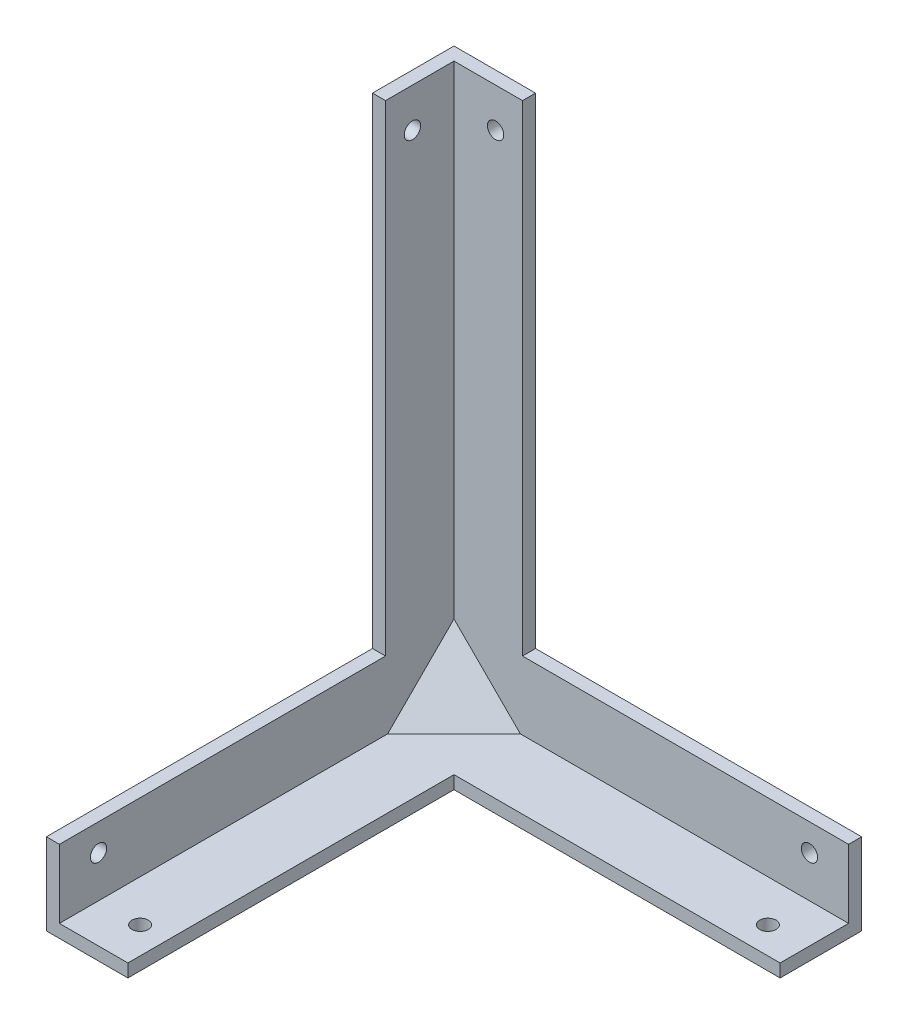
ISO-10303-21;
HEADER;
FILE_DESCRIPTION(('STEP AP214'),'2;1');
FILE_NAME('part.step','',(''),(''),'','','');
FILE_SCHEMA(('AUTOMOTIVE_DESIGN { 1 0 10303 214 1 1 1 1 }'));
ENDSEC;
DATA;
#1=APPLICATION_CONTEXT('core data for automotive mechanical design processes');
#2=APPLICATION_PROTOCOL_DEFINITION('international standard','automotive_design',2000,#1);
#3=PRODUCT_CONTEXT('',#1,'mechanical');
#4=PRODUCT('Part','Part','',(#3));
#5=PRODUCT_RELATED_PRODUCT_CATEGORY('part','',(#4));
#6=PRODUCT_DEFINITION_FORMATION('','',#4);
#7=PRODUCT_DEFINITION_CONTEXT('part definition',#1,'design');
#8=PRODUCT_DEFINITION('design','',#6,#7);
#9=PRODUCT_DEFINITION_SHAPE('','',#8);
#10=(LENGTH_UNIT() NAMED_UNIT(*) SI_UNIT(.MILLI.,.METRE.));
#11=(NAMED_UNIT(*) PLANE_ANGLE_UNIT() SI_UNIT($,.RADIAN.));
#12=(NAMED_UNIT(*) SI_UNIT($,.STERADIAN.) SOLID_ANGLE_UNIT());
#13=UNCERTAINTY_MEASURE_WITH_UNIT(LENGTH_MEASURE(1.E-05),#10,'distance_accuracy_value','');
#14=(GEOMETRIC_REPRESENTATION_CONTEXT(3) GLOBAL_UNCERTAINTY_ASSIGNED_CONTEXT((#13)) GLOBAL_UNIT_ASSIGNED_CONTEXT((#10,
#11,#12)) REPRESENTATION_CONTEXT('',''));
#15=CARTESIAN_POINT('',(0.,0.,0.));
#16=DIRECTION('',(0.,0.,1.));
#17=DIRECTION('',(1.,0.,0.));
#18=AXIS2_PLACEMENT_3D('',#15,#16,#17);
#19=CARTESIAN_POINT('',(4.,25.,125.));
#20=DIRECTION('',(0.,-1.,0.));
#21=DIRECTION('',(0.,0.,-1.));
#22=AXIS2_PLACEMENT_3D('',#19,#20,#21);
#23=PLANE('',#22);
#24=DIRECTION('',(0.,0.,-1.));
#25=VECTOR('',#24,1.);
#26=CARTESIAN_POINT('',(4.,25.,125.));
#27=LINE('',#26,#25);
#28=CARTESIAN_POINT('',(4.,25.,125.));
#29=VERTEX_POINT('',#28);
#30=CARTESIAN_POINT('',(4.,25.,25.));
#31=VERTEX_POINT('',#30);
#32=EDGE_CURVE('E270',#29,#31,#27,.T.);
#33=ORIENTED_EDGE('',*,*,#32,.T.);
#34=DIRECTION('',(-1.,0.,0.));
#35=VECTOR('',#34,1.);
#36=CARTESIAN_POINT('',(4.,25.,25.));
#37=LINE('',#36,#35);
#38=CARTESIAN_POINT('',(0.,25.,25.));
#39=VERTEX_POINT('',#38);
#40=EDGE_CURVE('E221',#31,#39,#37,.T.);
#41=ORIENTED_EDGE('',*,*,#40,.T.);
#42=DIRECTION('',(0.,0.,-1.));
#43=VECTOR('',#42,1.);
#44=CARTESIAN_POINT('',(0.,25.,125.));
#45=LINE('',#44,#43);
#46=CARTESIAN_POINT('',(0.,25.,125.));
#47=VERTEX_POINT('',#46);
#48=EDGE_CURVE('E47',#47,#39,#45,.T.);
#49=ORIENTED_EDGE('',*,*,#48,.F.);
#50=DIRECTION('',(-1.,0.,0.));
#51=VECTOR('',#50,1.);
#52=CARTESIAN_POINT('',(4.,25.,125.));
#53=LINE('',#52,#51);
#54=EDGE_CURVE('E256',#29,#47,#53,.T.);
#55=ORIENTED_EDGE('',*,*,#54,.F.);
#56=EDGE_LOOP('',(#33,#41,#49,#55));
#57=FACE_BOUND('',#56,.T.);
#58=ADVANCED_FACE('F39',(#57),#23,.F.);
#59=DIRECTION('',(-1.,0.,0.));
#60=VECTOR('',#59,1.);
#61=CARTESIAN_POINT('',(4.,25.,0.));
#62=LINE('',#61,#60);
#63=CARTESIAN_POINT('',(125.,25.,0.));
#64=VERTEX_POINT('',#63);
#65=CARTESIAN_POINT('',(25.,25.,0.));
#66=VERTEX_POINT('',#65);
#67=EDGE_CURVE('E255',#64,#66,#62,.T.);
#68=ORIENTED_EDGE('',*,*,#67,.T.);
#69=DIRECTION('',(0.,0.,1.));
#70=VECTOR('',#69,1.);
#71=CARTESIAN_POINT('',(25.,25.,125.));
#72=LINE('',#71,#70);
#73=CARTESIAN_POINT('',(25.,25.,4.));
#74=VERTEX_POINT('',#73);
#75=EDGE_CURVE('E212',#66,#74,#72,.T.);
#76=ORIENTED_EDGE('',*,*,#75,.T.);
#77=DIRECTION('',(-1.,0.,0.));
#78=VECTOR('',#77,1.);
#79=CARTESIAN_POINT('',(125.,25.,4.));
#80=LINE('',#79,#78);
#81=CARTESIAN_POINT('',(125.,25.,4.));
#82=VERTEX_POINT('',#81);
#83=EDGE_CURVE('E243',#82,#74,#80,.T.);
#84=ORIENTED_EDGE('',*,*,#83,.F.);
#85=DIRECTION('',(0.,0.,-1.));
#86=VECTOR('',#85,1.);
#87=CARTESIAN_POINT('',(125.,25.,0.));
#88=LINE('',#87,#86);
#89=EDGE_CURVE('E236',#82,#64,#88,.T.);
#90=ORIENTED_EDGE('',*,*,#89,.T.);
#91=EDGE_LOOP('',(#68,#76,#84,#90));
#92=FACE_BOUND('',#91,.T.);
#93=ADVANCED_FACE('F41',(#92),#23,.F.);
#94=CARTESIAN_POINT('',(0.,25.,125.));
#95=DIRECTION('',(1.,0.,0.));
#96=DIRECTION('',(0.,1.,0.));
#97=AXIS2_PLACEMENT_3D('',#94,#95,#96);
#98=PLANE('',#97);
#99=CARTESIAN_POINT('',(0.,16.75,113.));
#100=DIRECTION('',(1.,0.,0.));
#101=DIRECTION('',(0.,0.,-1.));
#102=AXIS2_PLACEMENT_3D('',#99,#100,#101);
#103=CIRCLE('',#102,2.5);
#104=CARTESIAN_POINT('',(0.,16.75,110.5));
#105=VERTEX_POINT('',#104);
#106=EDGE_CURVE('E172',#105,#105,#103,.T.);
#107=ORIENTED_EDGE('',*,*,#106,.T.);
#108=EDGE_LOOP('',(#107));
#109=FACE_BOUND('',#108,.T.);
#110=CARTESIAN_POINT('',(0.,160.5,16.75));
#111=DIRECTION('',(1.,0.,0.));
#112=DIRECTION('',(0.,0.,-1.));
#113=AXIS2_PLACEMENT_3D('',#110,#111,#112);
#114=CIRCLE('',#113,2.5);
#115=CARTESIAN_POINT('',(0.,160.5,14.25));
#116=VERTEX_POINT('',#115);
#117=EDGE_CURVE('E178',#116,#116,#114,.T.);
#118=ORIENTED_EDGE('',*,*,#117,.T.);
#119=EDGE_LOOP('',(#118));
#120=FACE_BOUND('',#119,.T.);
#121=ORIENTED_EDGE('',*,*,#48,.T.);
#122=DIRECTION('',(0.,-1.,0.));
#123=VECTOR('',#122,1.);
#124=CARTESIAN_POINT('',(0.,172.5,25.));
#125=LINE('',#124,#123);
#126=CARTESIAN_POINT('',(0.,172.5,25.));
#127=VERTEX_POINT('',#126);
#128=EDGE_CURVE('E208',#127,#39,#125,.T.);
#129=ORIENTED_EDGE('',*,*,#128,.F.);
#130=DIRECTION('',(0.,0.,-1.));
#131=VECTOR('',#130,1.);
#132=CARTESIAN_POINT('',(0.,172.5,25.));
#133=LINE('',#132,#131);
#134=CARTESIAN_POINT('',(0.,172.5,0.));
#135=VERTEX_POINT('',#134);
#136=EDGE_CURVE('E196',#127,#135,#133,.T.);
#137=ORIENTED_EDGE('',*,*,#136,.T.);
#138=DIRECTION('',(0.,-1.,0.));
#139=VECTOR('',#138,1.);
#140=CARTESIAN_POINT('',(0.,25.,0.));
#141=LINE('',#140,#139);
#142=CARTESIAN_POINT('',(0.,0.,0.));
#143=VERTEX_POINT('',#142);
#144=EDGE_CURVE('E273',#135,#143,#141,.T.);
#145=ORIENTED_EDGE('',*,*,#144,.T.);
#146=DIRECTION('',(0.,0.,-1.));
#147=VECTOR('',#146,1.);
#148=CARTESIAN_POINT('',(0.,0.,125.));
#149=LINE('',#148,#147);
#150=CARTESIAN_POINT('',(0.,0.,125.));
#151=VERTEX_POINT('',#150);
#152=EDGE_CURVE('E286',#151,#143,#149,.T.);
#153=ORIENTED_EDGE('',*,*,#152,.F.);
#154=DIRECTION('',(0.,-1.,0.));
#155=VECTOR('',#154,1.);
#156=CARTESIAN_POINT('',(0.,25.,125.));
#157=LINE('',#156,#155);
#158=EDGE_CURVE('E259',#47,#151,#157,.T.);
#159=ORIENTED_EDGE('',*,*,#158,.F.);
#160=EDGE_LOOP('',(#121,#129,#137,#145,#153,#159));
#161=FACE_BOUND('',#160,.T.);
#162=ADVANCED_FACE('F290',(#109,#120,#161),#98,.F.);
#163=CARTESIAN_POINT('',(0.,0.,125.));
#164=DIRECTION('',(0.,1.,0.));
#165=DIRECTION('',(0.,0.,1.));
#166=AXIS2_PLACEMENT_3D('',#163,#164,#165);
#167=PLANE('',#166);
#168=CARTESIAN_POINT('',(113.,0.,16.75));
#169=DIRECTION('',(0.,1.,0.));
#170=DIRECTION('',(0.,0.,1.));
#171=AXIS2_PLACEMENT_3D('',#168,#169,#170);
#172=CIRCLE('',#171,2.5);
#173=CARTESIAN_POINT('',(113.,0.,19.25));
#174=VERTEX_POINT('',#173);
#175=EDGE_CURVE('E184',#174,#174,#172,.T.);
#176=ORIENTED_EDGE('',*,*,#175,.T.);
#177=EDGE_LOOP('',(#176));
#178=FACE_BOUND('',#177,.T.);
#179=CARTESIAN_POINT('',(16.75,0.,113.));
#180=DIRECTION('',(0.,1.,0.));
#181=DIRECTION('',(0.,0.,1.));
#182=AXIS2_PLACEMENT_3D('',#179,#180,#181);
#183=CIRCLE('',#182,2.5);
#184=CARTESIAN_POINT('',(16.75,0.,115.5));
#185=VERTEX_POINT('',#184);
#186=EDGE_CURVE('E190',#185,#185,#183,.T.);
#187=ORIENTED_EDGE('',*,*,#186,.T.);
#188=EDGE_LOOP('',(#187));
#189=FACE_BOUND('',#188,.T.);
#190=ORIENTED_EDGE('',*,*,#152,.T.);
#191=DIRECTION('',(1.,0.,0.));
#192=VECTOR('',#191,1.);
#193=CARTESIAN_POINT('',(0.,0.,0.));
#194=LINE('',#193,#192);
#195=CARTESIAN_POINT('',(125.,0.,0.));
#196=VERTEX_POINT('',#195);
#197=EDGE_CURVE('E260',#143,#196,#194,.T.);
#198=ORIENTED_EDGE('',*,*,#197,.T.);
#199=DIRECTION('',(0.,0.,1.));
#200=VECTOR('',#199,1.);
#201=CARTESIAN_POINT('',(125.,0.,25.));
#202=LINE('',#201,#200);
#203=CARTESIAN_POINT('',(125.,0.,25.));
#204=VERTEX_POINT('',#203);
#205=EDGE_CURVE('E224',#196,#204,#202,.T.);
#206=ORIENTED_EDGE('',*,*,#205,.T.);
#207=DIRECTION('',(-1.,0.,0.));
#208=VECTOR('',#207,1.);
#209=CARTESIAN_POINT('',(125.,0.,25.));
#210=LINE('',#209,#208);
#211=CARTESIAN_POINT('',(25.,0.,25.));
#212=VERTEX_POINT('',#211);
#213=EDGE_CURVE('E242',#204,#212,#210,.T.);
#214=ORIENTED_EDGE('',*,*,#213,.T.);
#215=DIRECTION('',(0.,0.,-1.));
#216=VECTOR('',#215,1.);
#217=CARTESIAN_POINT('',(25.,0.,125.));
#218=LINE('',#217,#216);
#219=CARTESIAN_POINT('',(25.,0.,125.));
#220=VERTEX_POINT('',#219);
#221=EDGE_CURVE('E283',#220,#212,#218,.T.);
#222=ORIENTED_EDGE('',*,*,#221,.F.);
#223=DIRECTION('',(1.,0.,0.));
#224=VECTOR('',#223,1.);
#225=CARTESIAN_POINT('',(0.,0.,125.));
#226=LINE('',#225,#224);
#227=EDGE_CURVE('E262',#151,#220,#226,.T.);
#228=ORIENTED_EDGE('',*,*,#227,.F.);
#229=EDGE_LOOP('',(#190,#198,#206,#214,#222,#228));
#230=FACE_BOUND('',#229,.T.);
#231=ADVANCED_FACE('F310',(#178,#189,#230),#167,.F.);
#232=CARTESIAN_POINT('',(25.,0.,125.));
#233=DIRECTION('',(-1.,0.,0.));
#234=DIRECTION('',(0.,0.,1.));
#235=AXIS2_PLACEMENT_3D('',#232,#233,#234);
#236=PLANE('',#235);
#237=ORIENTED_EDGE('',*,*,#221,.T.);
#238=DIRECTION('',(0.,1.,0.));
#239=VECTOR('',#238,1.);
#240=CARTESIAN_POINT('',(25.,0.,25.));
#241=LINE('',#240,#239);
#242=CARTESIAN_POINT('',(25.,4.,25.));
#243=VERTEX_POINT('',#242);
#244=EDGE_CURVE('E246',#212,#243,#241,.T.);
#245=ORIENTED_EDGE('',*,*,#244,.T.);
#246=DIRECTION('',(0.,0.,-1.));
#247=VECTOR('',#246,1.);
#248=CARTESIAN_POINT('',(25.,4.,125.));
#249=LINE('',#248,#247);
#250=CARTESIAN_POINT('',(25.,4.,125.));
#251=VERTEX_POINT('',#250);
#252=EDGE_CURVE('E280',#251,#243,#249,.T.);
#253=ORIENTED_EDGE('',*,*,#252,.F.);
#254=DIRECTION('',(0.,1.,0.));
#255=VECTOR('',#254,1.);
#256=CARTESIAN_POINT('',(25.,0.,125.));
#257=LINE('',#256,#255);
#258=EDGE_CURVE('E264',#220,#251,#257,.T.);
#259=ORIENTED_EDGE('',*,*,#258,.F.);
#260=EDGE_LOOP('',(#237,#245,#253,#259));
#261=FACE_BOUND('',#260,.T.);
#262=ADVANCED_FACE('F322',(#261),#236,.F.);
#263=CARTESIAN_POINT('',(25.,4.,125.));
#264=DIRECTION('',(0.,-1.,0.));
#265=DIRECTION('',(1.,0.,0.));
#266=AXIS2_PLACEMENT_3D('',#263,#264,#265);
#267=PLANE('',#266);
#268=CARTESIAN_POINT('',(113.,4.00000000000002,16.75));
#269=DIRECTION('',(0.,1.,0.));
#270=DIRECTION('',(0.,0.,1.));
#271=AXIS2_PLACEMENT_3D('',#268,#269,#270);
#272=CIRCLE('',#271,2.5);
#273=CARTESIAN_POINT('',(113.,4.00000000000002,19.25));
#274=VERTEX_POINT('',#273);
#275=EDGE_CURVE('E181',#274,#274,#272,.T.);
#276=ORIENTED_EDGE('',*,*,#275,.F.);
#277=EDGE_LOOP('',(#276));
#278=FACE_BOUND('',#277,.T.);
#279=CARTESIAN_POINT('',(16.75,4.,113.));
#280=DIRECTION('',(0.,1.,0.));
#281=DIRECTION('',(0.,0.,1.));
#282=AXIS2_PLACEMENT_3D('',#279,#280,#281);
#283=CIRCLE('',#282,2.5);
#284=CARTESIAN_POINT('',(16.75,4.,115.5));
#285=VERTEX_POINT('',#284);
#286=EDGE_CURVE('E187',#285,#285,#283,.T.);
#287=ORIENTED_EDGE('',*,*,#286,.F.);
#288=EDGE_LOOP('',(#287));
#289=FACE_BOUND('',#288,.T.);
#290=DIRECTION('',(-1.,0.,0.));
#291=VECTOR('',#290,1.);
#292=CARTESIAN_POINT('',(125.,4.,4.));
#293=LINE('',#292,#291);
#294=CARTESIAN_POINT('',(125.,4.,4.));
#295=VERTEX_POINT('',#294);
#296=CARTESIAN_POINT('',(24.349364905389,3.99999999999999,4.));
#297=VERTEX_POINT('',#296);
#298=EDGE_CURVE('E247',#295,#297,#293,.T.);
#299=ORIENTED_EDGE('',*,*,#298,.T.);
#300=DIRECTION('',(0.707106781186547,0.,-0.707106781186548));
#301=VECTOR('',#300,1.);
#302=CARTESIAN_POINT('',(14.1746824526945,4.,14.1746824526945));
#303=LINE('',#302,#301);
#304=CARTESIAN_POINT('',(4.,4.,24.349364905389));
#305=VERTEX_POINT('',#304);
#306=EDGE_CURVE('E54',#305,#297,#303,.T.);
#307=ORIENTED_EDGE('',*,*,#306,.F.);
#308=DIRECTION('',(0.,0.,-1.));
#309=VECTOR('',#308,1.);
#310=CARTESIAN_POINT('',(4.,4.,125.));
#311=LINE('',#310,#309);
#312=CARTESIAN_POINT('',(4.,4.,125.));
#313=VERTEX_POINT('',#312);
#314=EDGE_CURVE('E150',#313,#305,#311,.T.);
#315=ORIENTED_EDGE('',*,*,#314,.F.);
#316=DIRECTION('',(-1.,0.,0.));
#317=VECTOR('',#316,1.);
#318=CARTESIAN_POINT('',(25.,4.,125.));
#319=LINE('',#318,#317);
#320=EDGE_CURVE('E266',#251,#313,#319,.T.);
#321=ORIENTED_EDGE('',*,*,#320,.F.);
#322=ORIENTED_EDGE('',*,*,#252,.T.);
#323=DIRECTION('',(-1.,0.,0.));
#324=VECTOR('',#323,1.);
#325=CARTESIAN_POINT('',(125.,4.,25.));
#326=LINE('',#325,#324);
#327=CARTESIAN_POINT('',(125.,4.,25.));
#328=VERTEX_POINT('',#327);
#329=EDGE_CURVE('E249',#328,#243,#326,.T.);
#330=ORIENTED_EDGE('',*,*,#329,.F.);
#331=DIRECTION('',(0.,0.,-1.));
#332=VECTOR('',#331,1.);
#333=CARTESIAN_POINT('',(125.,4.,4.));
#334=LINE('',#333,#332);
#335=EDGE_CURVE('E230',#328,#295,#334,.T.);
#336=ORIENTED_EDGE('',*,*,#335,.T.);
#337=EDGE_LOOP('',(#299,#307,#315,#321,#322,#330,#336));
#338=FACE_BOUND('',#337,.T.);
#339=ADVANCED_FACE('F327',(#278,#289,#338),#267,.F.);
#340=CARTESIAN_POINT('',(4.,4.,125.));
#341=DIRECTION('',(-1.,0.,0.));
#342=DIRECTION('',(0.,0.,1.));
#343=AXIS2_PLACEMENT_3D('',#340,#341,#342);
#344=PLANE('',#343);
#345=CARTESIAN_POINT('',(4.,16.75,113.));
#346=DIRECTION('',(1.,0.,0.));
#347=DIRECTION('',(0.,0.,-1.));
#348=AXIS2_PLACEMENT_3D('',#345,#346,#347);
#349=CIRCLE('',#348,2.5);
#350=CARTESIAN_POINT('',(4.,16.75,110.5));
#351=VERTEX_POINT('',#350);
#352=EDGE_CURVE('E169',#351,#351,#349,.T.);
#353=ORIENTED_EDGE('',*,*,#352,.F.);
#354=EDGE_LOOP('',(#353));
#355=FACE_BOUND('',#354,.T.);
#356=CARTESIAN_POINT('',(4.,160.5,16.75));
#357=DIRECTION('',(1.,0.,0.));
#358=DIRECTION('',(0.,0.,-1.));
#359=AXIS2_PLACEMENT_3D('',#356,#357,#358);
#360=CIRCLE('',#359,2.5);
#361=CARTESIAN_POINT('',(4.,160.5,14.25));
#362=VERTEX_POINT('',#361);
#363=EDGE_CURVE('E175',#362,#362,#360,.T.);
#364=ORIENTED_EDGE('',*,*,#363,.F.);
#365=EDGE_LOOP('',(#364));
#366=FACE_BOUND('',#365,.T.);
#367=ORIENTED_EDGE('',*,*,#314,.T.);
#368=DIRECTION('',(0.,-0.707106781186547,0.707106781186548));
#369=VECTOR('',#368,1.);
#370=CARTESIAN_POINT('',(4.00000000000001,14.1746824526945,14.1746824526945));
#371=LINE('',#370,#369);
#372=CARTESIAN_POINT('',(4.,24.349364905389,3.99999999999999));
#373=VERTEX_POINT('',#372);
#374=EDGE_CURVE('E147',#373,#305,#371,.T.);
#375=ORIENTED_EDGE('',*,*,#374,.F.);
#376=DIRECTION('',(0.,1.,0.));
#377=VECTOR('',#376,1.);
#378=CARTESIAN_POINT('',(4.,3.99999999999998,4.));
#379=LINE('',#378,#377);
#380=CARTESIAN_POINT('',(4.,172.5,4.));
#381=VERTEX_POINT('',#380);
#382=EDGE_CURVE('E11',#373,#381,#379,.T.);
#383=ORIENTED_EDGE('',*,*,#382,.T.);
#384=DIRECTION('',(0.,0.,1.));
#385=VECTOR('',#384,1.);
#386=CARTESIAN_POINT('',(4.,172.5,4.));
#387=LINE('',#386,#385);
#388=CARTESIAN_POINT('',(4.,172.5,25.));
#389=VERTEX_POINT('',#388);
#390=EDGE_CURVE('E206',#381,#389,#387,.T.);
#391=ORIENTED_EDGE('',*,*,#390,.T.);
#392=DIRECTION('',(0.,-1.,0.));
#393=VECTOR('',#392,1.);
#394=CARTESIAN_POINT('',(4.,172.5,25.));
#395=LINE('',#394,#393);
#396=EDGE_CURVE('E209',#389,#31,#395,.T.);
#397=ORIENTED_EDGE('',*,*,#396,.T.);
#398=ORIENTED_EDGE('',*,*,#32,.F.);
#399=DIRECTION('',(0.,1.,0.));
#400=VECTOR('',#399,1.);
#401=CARTESIAN_POINT('',(4.,4.,125.));
#402=LINE('',#401,#400);
#403=EDGE_CURVE('E268',#313,#29,#402,.T.);
#404=ORIENTED_EDGE('',*,*,#403,.F.);
#405=EDGE_LOOP('',(#367,#375,#383,#391,#397,#398,#404));
#406=FACE_BOUND('',#405,.T.);
#407=ADVANCED_FACE('F148',(#355,#366,#406),#344,.F.);
#408=CARTESIAN_POINT('',(0.,0.,125.));
#409=DIRECTION('',(0.,0.,1.));
#410=DIRECTION('',(1.,0.,0.));
#411=AXIS2_PLACEMENT_3D('',#408,#409,#410);
#412=PLANE('',#411);
#413=ORIENTED_EDGE('',*,*,#54,.T.);
#414=ORIENTED_EDGE('',*,*,#158,.T.);
#415=ORIENTED_EDGE('',*,*,#227,.T.);
#416=ORIENTED_EDGE('',*,*,#258,.T.);
#417=ORIENTED_EDGE('',*,*,#320,.T.);
#418=ORIENTED_EDGE('',*,*,#403,.T.);
#419=EDGE_LOOP('',(#413,#414,#415,#416,#417,#418));
#420=FACE_BOUND('',#419,.T.);
#421=ADVANCED_FACE('F326',(#420),#412,.T.);
#422=CARTESIAN_POINT('',(0.,0.,0.));
#423=DIRECTION('',(0.,0.,1.));
#424=DIRECTION('',(1.,0.,0.));
#425=AXIS2_PLACEMENT_3D('',#422,#423,#424);
#426=PLANE('',#425);
#427=CARTESIAN_POINT('',(16.75,160.5,0.));
#428=DIRECTION('',(0.,0.,1.));
#429=DIRECTION('',(1.,0.,0.));
#430=AXIS2_PLACEMENT_3D('',#427,#428,#429);
#431=CIRCLE('',#430,2.5);
#432=CARTESIAN_POINT('',(19.25,160.5,0.));
#433=VERTEX_POINT('',#432);
#434=EDGE_CURVE('E160',#433,#433,#431,.T.);
#435=ORIENTED_EDGE('',*,*,#434,.T.);
#436=EDGE_LOOP('',(#435));
#437=FACE_BOUND('',#436,.T.);
#438=CARTESIAN_POINT('',(113.,16.75,0.));
#439=DIRECTION('',(0.,0.,1.));
#440=DIRECTION('',(1.,0.,0.));
#441=AXIS2_PLACEMENT_3D('',#438,#439,#440);
#442=CIRCLE('',#441,2.5);
#443=CARTESIAN_POINT('',(115.5,16.75,0.));
#444=VERTEX_POINT('',#443);
#445=EDGE_CURVE('E166',#444,#444,#442,.T.);
#446=ORIENTED_EDGE('',*,*,#445,.T.);
#447=EDGE_LOOP('',(#446));
#448=FACE_BOUND('',#447,.T.);
#449=DIRECTION('',(0.,-1.,0.));
#450=VECTOR('',#449,1.);
#451=CARTESIAN_POINT('',(125.,0.,0.));
#452=LINE('',#451,#450);
#453=EDGE_CURVE('E239',#64,#196,#452,.T.);
#454=ORIENTED_EDGE('',*,*,#453,.T.);
#455=ORIENTED_EDGE('',*,*,#197,.F.);
#456=ORIENTED_EDGE('',*,*,#144,.F.);
#457=DIRECTION('',(1.,0.,0.));
#458=VECTOR('',#457,1.);
#459=CARTESIAN_POINT('',(0.,172.5,0.));
#460=LINE('',#459,#458);
#461=CARTESIAN_POINT('',(25.,172.5,0.));
#462=VERTEX_POINT('',#461);
#463=EDGE_CURVE('E199',#135,#462,#460,.T.);
#464=ORIENTED_EDGE('',*,*,#463,.T.);
#465=DIRECTION('',(0.,-1.,0.));
#466=VECTOR('',#465,1.);
#467=CARTESIAN_POINT('',(25.,172.5,0.));
#468=LINE('',#467,#466);
#469=EDGE_CURVE('E215',#462,#66,#468,.T.);
#470=ORIENTED_EDGE('',*,*,#469,.T.);
#471=ORIENTED_EDGE('',*,*,#67,.F.);
#472=EDGE_LOOP('',(#454,#455,#456,#464,#470,#471));
#473=FACE_BOUND('',#472,.T.);
#474=ADVANCED_FACE('F306',(#437,#448,#473),#426,.F.);
#475=CARTESIAN_POINT('',(125.,4.,25.));
#476=DIRECTION('',(0.,0.,1.));
#477=DIRECTION('',(1.,0.,0.));
#478=AXIS2_PLACEMENT_3D('',#475,#476,#477);
#479=PLANE('',#478);
#480=ORIENTED_EDGE('',*,*,#244,.F.);
#481=ORIENTED_EDGE('',*,*,#213,.F.);
#482=DIRECTION('',(0.,1.,0.));
#483=VECTOR('',#482,1.);
#484=CARTESIAN_POINT('',(125.,4.,25.));
#485=LINE('',#484,#483);
#486=EDGE_CURVE('E227',#204,#328,#485,.T.);
#487=ORIENTED_EDGE('',*,*,#486,.T.);
#488=ORIENTED_EDGE('',*,*,#329,.T.);
#489=EDGE_LOOP('',(#480,#481,#487,#488));
#490=FACE_BOUND('',#489,.T.);
#491=ADVANCED_FACE('F318',(#490),#479,.T.);
#492=CARTESIAN_POINT('',(125.,25.,4.));
#493=DIRECTION('',(0.,0.,1.));
#494=DIRECTION('',(0.,-1.,0.));
#495=AXIS2_PLACEMENT_3D('',#492,#493,#494);
#496=PLANE('',#495);
#497=DIRECTION('',(-0.707106781186548,0.707106781186547,0.));
#498=VECTOR('',#497,1.);
#499=CARTESIAN_POINT('',(14.1746824526945,14.1746824526945,4.00000000000001));
#500=LINE('',#499,#498);
#501=EDGE_CURVE('E62',#297,#373,#500,.T.);
#502=ORIENTED_EDGE('',*,*,#501,.F.);
#503=ORIENTED_EDGE('',*,*,#298,.F.);
#504=DIRECTION('',(0.,1.,0.));
#505=VECTOR('',#504,1.);
#506=CARTESIAN_POINT('',(125.,25.,4.));
#507=LINE('',#506,#505);
#508=EDGE_CURVE('E233',#295,#82,#507,.T.);
#509=ORIENTED_EDGE('',*,*,#508,.T.);
#510=ORIENTED_EDGE('',*,*,#83,.T.);
#511=DIRECTION('',(0.,-1.,0.));
#512=VECTOR('',#511,1.);
#513=CARTESIAN_POINT('',(25.,172.5,4.));
#514=LINE('',#513,#512);
#515=CARTESIAN_POINT('',(25.,172.5,4.));
#516=VERTEX_POINT('',#515);
#517=EDGE_CURVE('E213',#516,#74,#514,.T.);
#518=ORIENTED_EDGE('',*,*,#517,.F.);
#519=DIRECTION('',(-1.,0.,0.));
#520=VECTOR('',#519,1.);
#521=CARTESIAN_POINT('',(25.,172.5,4.));
#522=LINE('',#521,#520);
#523=EDGE_CURVE('E142',#516,#381,#522,.T.);
#524=ORIENTED_EDGE('',*,*,#523,.T.);
#525=ORIENTED_EDGE('',*,*,#382,.F.);
#526=EDGE_LOOP('',(#502,#503,#509,#510,#518,#524,#525));
#527=FACE_BOUND('',#526,.T.);
#528=CARTESIAN_POINT('',(16.75,160.5,4.));
#529=DIRECTION('',(0.,0.,1.));
#530=DIRECTION('',(1.,0.,0.));
#531=AXIS2_PLACEMENT_3D('',#528,#529,#530);
#532=CIRCLE('',#531,2.5);
#533=CARTESIAN_POINT('',(19.25,160.5,4.));
#534=VERTEX_POINT('',#533);
#535=EDGE_CURVE('E157',#534,#534,#532,.T.);
#536=ORIENTED_EDGE('',*,*,#535,.F.);
#537=EDGE_LOOP('',(#536));
#538=FACE_BOUND('',#537,.T.);
#539=CARTESIAN_POINT('',(113.,16.75,4.));
#540=DIRECTION('',(0.,0.,1.));
#541=DIRECTION('',(1.,0.,0.));
#542=AXIS2_PLACEMENT_3D('',#539,#540,#541);
#543=CIRCLE('',#542,2.5);
#544=CARTESIAN_POINT('',(115.5,16.75,4.));
#545=VERTEX_POINT('',#544);
#546=EDGE_CURVE('E163',#545,#545,#543,.T.);
#547=ORIENTED_EDGE('',*,*,#546,.F.);
#548=EDGE_LOOP('',(#547));
#549=FACE_BOUND('',#548,.T.);
#550=ADVANCED_FACE('F139',(#527,#538,#549),#496,.T.);
#551=CARTESIAN_POINT('',(125.,0.,0.));
#552=DIRECTION('',(1.,0.,0.));
#553=DIRECTION('',(0.,1.,0.));
#554=AXIS2_PLACEMENT_3D('',#551,#552,#553);
#555=PLANE('',#554);
#556=ORIENTED_EDGE('',*,*,#205,.F.);
#557=ORIENTED_EDGE('',*,*,#453,.F.);
#558=ORIENTED_EDGE('',*,*,#89,.F.);
#559=ORIENTED_EDGE('',*,*,#508,.F.);
#560=ORIENTED_EDGE('',*,*,#335,.F.);
#561=ORIENTED_EDGE('',*,*,#486,.F.);
#562=EDGE_LOOP('',(#556,#557,#558,#559,#560,#561));
#563=FACE_BOUND('',#562,.T.);
#564=ADVANCED_FACE('F313',(#563),#555,.T.);
#565=CARTESIAN_POINT('',(4.,172.5,25.));
#566=DIRECTION('',(0.,0.,1.));
#567=DIRECTION('',(1.,0.,0.));
#568=AXIS2_PLACEMENT_3D('',#565,#566,#567);
#569=PLANE('',#568);
#570=ORIENTED_EDGE('',*,*,#40,.F.);
#571=ORIENTED_EDGE('',*,*,#396,.F.);
#572=DIRECTION('',(-1.,0.,0.));
#573=VECTOR('',#572,1.);
#574=CARTESIAN_POINT('',(4.,172.5,25.));
#575=LINE('',#574,#573);
#576=EDGE_CURVE('E193',#389,#127,#575,.T.);
#577=ORIENTED_EDGE('',*,*,#576,.T.);
#578=ORIENTED_EDGE('',*,*,#128,.T.);
#579=EDGE_LOOP('',(#570,#571,#577,#578));
#580=FACE_BOUND('',#579,.T.);
#581=ADVANCED_FACE('F297',(#580),#569,.T.);
#582=CARTESIAN_POINT('',(25.,172.5,0.));
#583=DIRECTION('',(1.,0.,0.));
#584=DIRECTION('',(0.,0.,-1.));
#585=AXIS2_PLACEMENT_3D('',#582,#583,#584);
#586=PLANE('',#585);
#587=ORIENTED_EDGE('',*,*,#75,.F.);
#588=ORIENTED_EDGE('',*,*,#469,.F.);
#589=DIRECTION('',(0.,0.,1.));
#590=VECTOR('',#589,1.);
#591=CARTESIAN_POINT('',(25.,172.5,0.));
#592=LINE('',#591,#590);
#593=EDGE_CURVE('E202',#462,#516,#592,.T.);
#594=ORIENTED_EDGE('',*,*,#593,.T.);
#595=ORIENTED_EDGE('',*,*,#517,.T.);
#596=EDGE_LOOP('',(#587,#588,#594,#595));
#597=FACE_BOUND('',#596,.T.);
#598=ADVANCED_FACE('F351',(#597),#586,.T.);
#599=CARTESIAN_POINT('',(0.,172.5,0.));
#600=DIRECTION('',(0.,-1.,0.));
#601=DIRECTION('',(0.,0.,-1.));
#602=AXIS2_PLACEMENT_3D('',#599,#600,#601);
#603=PLANE('',#602);
#604=ORIENTED_EDGE('',*,*,#576,.F.);
#605=ORIENTED_EDGE('',*,*,#390,.F.);
#606=ORIENTED_EDGE('',*,*,#523,.F.);
#607=ORIENTED_EDGE('',*,*,#593,.F.);
#608=ORIENTED_EDGE('',*,*,#463,.F.);
#609=ORIENTED_EDGE('',*,*,#136,.F.);
#610=EDGE_LOOP('',(#604,#605,#606,#607,#608,#609));
#611=FACE_BOUND('',#610,.T.);
#612=ADVANCED_FACE('F300',(#611),#603,.F.);
#613=CARTESIAN_POINT('',(16.75,4.,113.));
#614=DIRECTION('',(0.,1.,0.));
#615=DIRECTION('',(0.,0.,1.));
#616=AXIS2_PLACEMENT_3D('',#613,#614,#615);
#617=CYLINDRICAL_SURFACE('',#616,2.5);
#618=ORIENTED_EDGE('',*,*,#186,.F.);
#619=EDGE_LOOP('',(#618));
#620=FACE_BOUND('',#619,.T.);
#621=ORIENTED_EDGE('',*,*,#286,.T.);
#622=EDGE_LOOP('',(#621));
#623=FACE_BOUND('',#622,.T.);
#624=ADVANCED_FACE('F358',(#620,#623),#617,.F.);
#625=CARTESIAN_POINT('',(113.,4.00000000000002,16.75));
#626=DIRECTION('',(0.,1.,0.));
#627=DIRECTION('',(0.,0.,1.));
#628=AXIS2_PLACEMENT_3D('',#625,#626,#627);
#629=CYLINDRICAL_SURFACE('',#628,2.5);
#630=ORIENTED_EDGE('',*,*,#175,.F.);
#631=EDGE_LOOP('',(#630));
#632=FACE_BOUND('',#631,.T.);
#633=ORIENTED_EDGE('',*,*,#275,.T.);
#634=EDGE_LOOP('',(#633));
#635=FACE_BOUND('',#634,.T.);
#636=ADVANCED_FACE('F400',(#632,#635),#629,.F.);
#637=CARTESIAN_POINT('',(4.,160.5,16.75));
#638=DIRECTION('',(1.,0.,0.));
#639=DIRECTION('',(0.,0.,-1.));
#640=AXIS2_PLACEMENT_3D('',#637,#638,#639);
#641=CYLINDRICAL_SURFACE('',#640,2.5);
#642=ORIENTED_EDGE('',*,*,#117,.F.);
#643=EDGE_LOOP('',(#642));
#644=FACE_BOUND('',#643,.T.);
#645=ORIENTED_EDGE('',*,*,#363,.T.);
#646=EDGE_LOOP('',(#645));
#647=FACE_BOUND('',#646,.T.);
#648=ADVANCED_FACE('F393',(#644,#647),#641,.F.);
#649=CARTESIAN_POINT('',(4.,16.75,113.));
#650=DIRECTION('',(1.,0.,0.));
#651=DIRECTION('',(0.,0.,-1.));
#652=AXIS2_PLACEMENT_3D('',#649,#650,#651);
#653=CYLINDRICAL_SURFACE('',#652,2.5);
#654=ORIENTED_EDGE('',*,*,#106,.F.);
#655=EDGE_LOOP('',(#654));
#656=FACE_BOUND('',#655,.T.);
#657=ORIENTED_EDGE('',*,*,#352,.T.);
#658=EDGE_LOOP('',(#657));
#659=FACE_BOUND('',#658,.T.);
#660=ADVANCED_FACE('F383',(#656,#659),#653,.F.);
#661=CARTESIAN_POINT('',(113.,16.75,4.));
#662=DIRECTION('',(0.,0.,1.));
#663=DIRECTION('',(1.,0.,0.));
#664=AXIS2_PLACEMENT_3D('',#661,#662,#663);
#665=CYLINDRICAL_SURFACE('',#664,2.5);
#666=ORIENTED_EDGE('',*,*,#445,.F.);
#667=EDGE_LOOP('',(#666));
#668=FACE_BOUND('',#667,.T.);
#669=ORIENTED_EDGE('',*,*,#546,.T.);
#670=EDGE_LOOP('',(#669));
#671=FACE_BOUND('',#670,.T.);
#672=ADVANCED_FACE('F379',(#668,#671),#665,.F.);
#673=CARTESIAN_POINT('',(16.75,160.5,4.));
#674=DIRECTION('',(0.,0.,1.));
#675=DIRECTION('',(1.,0.,0.));
#676=AXIS2_PLACEMENT_3D('',#673,#674,#675);
#677=CYLINDRICAL_SURFACE('',#676,2.5);
#678=ORIENTED_EDGE('',*,*,#434,.F.);
#679=EDGE_LOOP('',(#678));
#680=FACE_BOUND('',#679,.T.);
#681=ORIENTED_EDGE('',*,*,#535,.T.);
#682=EDGE_LOOP('',(#681));
#683=FACE_BOUND('',#682,.T.);
#684=ADVANCED_FACE('F382',(#680,#683),#677,.F.);
#685=CARTESIAN_POINT('',(10.7831216351297,10.7831216351297,10.7831216351297));
#686=DIRECTION('',(0.577350269189626,0.577350269189626,0.577350269189625));
#687=DIRECTION('',(-0.707106781186547,0.707106781186548,0.));
#688=AXIS2_PLACEMENT_3D('',#685,#686,#687);
#689=PLANE('',#688);
#690=ORIENTED_EDGE('',*,*,#501,.T.);
#691=ORIENTED_EDGE('',*,*,#374,.T.);
#692=ORIENTED_EDGE('',*,*,#306,.T.);
#693=EDGE_LOOP('',(#690,#691,#692));
#694=FACE_BOUND('',#693,.T.);
#695=ADVANCED_FACE('F153',(#694),#689,.T.);
#696=CLOSED_SHELL('',(#58,#93,#162,#231,#262,#339,#407,#421,#474,#491,#550,#564,#581,#598,#612,
#624,#636,#648,#660,#672,#684,#695));
#697=MANIFOLD_SOLID_BREP('B2',#696);
#698=ADVANCED_BREP_SHAPE_REPRESENTATION('',(#18,#697),#14);
#699=SHAPE_DEFINITION_REPRESENTATION(#9,#698);
ENDSEC;
END-ISO-10303-21;
